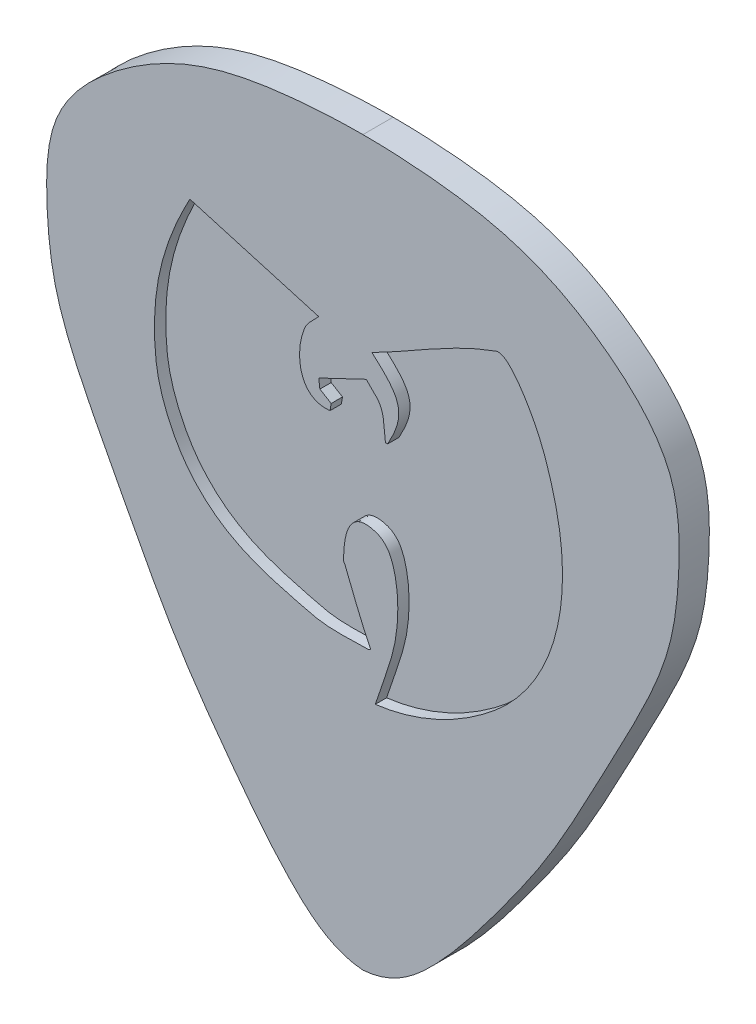
ISO-10303-21;
HEADER;
FILE_DESCRIPTION(('STEP AP214'),'2;1');
FILE_NAME('part.step','',(''),(''),'','','');
FILE_SCHEMA(('AUTOMOTIVE_DESIGN { 1 0 10303 214 1 1 1 1 }'));
ENDSEC;
DATA;
#1=APPLICATION_CONTEXT('core data for automotive mechanical design processes');
#2=APPLICATION_PROTOCOL_DEFINITION('international standard','automotive_design',2000,#1);
#3=PRODUCT_CONTEXT('',#1,'mechanical');
#4=PRODUCT('Part','Part','',(#3));
#5=PRODUCT_RELATED_PRODUCT_CATEGORY('part','',(#4));
#6=PRODUCT_DEFINITION_FORMATION('','',#4);
#7=PRODUCT_DEFINITION_CONTEXT('part definition',#1,'design');
#8=PRODUCT_DEFINITION('design','',#6,#7);
#9=PRODUCT_DEFINITION_SHAPE('','',#8);
#10=(LENGTH_UNIT() NAMED_UNIT(*) SI_UNIT(.MILLI.,.METRE.));
#11=(NAMED_UNIT(*) PLANE_ANGLE_UNIT() SI_UNIT($,.RADIAN.));
#12=(NAMED_UNIT(*) SI_UNIT($,.STERADIAN.) SOLID_ANGLE_UNIT());
#13=UNCERTAINTY_MEASURE_WITH_UNIT(LENGTH_MEASURE(1.E-05),#10,'distance_accuracy_value','');
#14=(GEOMETRIC_REPRESENTATION_CONTEXT(3) GLOBAL_UNCERTAINTY_ASSIGNED_CONTEXT((#13)) GLOBAL_UNIT_ASSIGNED_CONTEXT((#10,
#11,#12)) REPRESENTATION_CONTEXT('',''));
#15=CARTESIAN_POINT('',(0.,0.,0.));
#16=DIRECTION('',(0.,0.,1.));
#17=DIRECTION('',(1.,0.,0.));
#18=AXIS2_PLACEMENT_3D('',#15,#16,#17);
#19=CARTESIAN_POINT('',(0.,0.,1.33333333333333));
#20=CARTESIAN_POINT('',(-1.3725179585471,0.0920720774433055,1.33333333333333));
#21=CARTESIAN_POINT('',(-3.40311330723531,1.84725696244432,1.33333333333333));
#22=CARTESIAN_POINT('',(-5.83377601303966,4.99693592677089,1.33333333333333));
#23=CARTESIAN_POINT('',(-8.30396753302916,8.43054929060509,1.33333333333333));
#24=CARTESIAN_POINT('',(-10.213558633326,12.0661802752507,1.33333333333333));
#25=CARTESIAN_POINT('',(-12.1318717474483,15.6564896058509,1.33333333333333));
#26=CARTESIAN_POINT('',(-13.6853638227223,18.9210740220786,1.33333333333333));
#27=CARTESIAN_POINT('',(-14.0424116044245,22.4561533996481,1.33333333333333));
#28=CARTESIAN_POINT('',(-13.9658646966753,26.1770084955899,1.33333333333333));
#29=CARTESIAN_POINT('',(-10.9360646284182,29.231355796995,1.33333333333333));
#30=CARTESIAN_POINT('',(-7.15224424947317,31.2979340239972,1.33333333333333));
#31=CARTESIAN_POINT('',(-3.35647220863482,31.8876809648605,1.33333333333333));
#32=CARTESIAN_POINT('',(-0.93666484800668,32.004023721527,1.33333333333333));
#33=CARTESIAN_POINT('',(0.,32.0024926417289,1.33333333333333));
#34=B_SPLINE_CURVE_WITH_KNOTS('',3,(#19,#20,#21,#22,#23,#24,#25,#26,#27,#28,#29,#30,#31,#32,
#33),.UNSPECIFIED.,.F.,.F.,(4,1,1,1,1,1,1,1,1,1,1,1,4),(0.,0.0676881194936068,0.135065153333643,
0.209958152721667,0.288697785846604,0.349864900651225,0.424267439940274,0.47494369953207,
0.536327458499454,0.610656572670228,0.68545271983875,0.761085883741637,0.810203958906233),.UNSPECIFIED.);
#35=DIRECTION('',(0.,0.,-1.));
#36=VECTOR('',#35,1.);
#37=SURFACE_OF_LINEAR_EXTRUSION('',#34,#36);
#38=CARTESIAN_POINT('',(0.,0.,0.));
#39=CARTESIAN_POINT('',(-1.3725179585471,0.0920720774433055,0.));
#40=CARTESIAN_POINT('',(-3.40311330723531,1.84725696244432,0.));
#41=CARTESIAN_POINT('',(-5.83377601303966,4.99693592677089,0.));
#42=CARTESIAN_POINT('',(-8.30396753302916,8.43054929060509,0.));
#43=CARTESIAN_POINT('',(-10.213558633326,12.0661802752507,0.));
#44=CARTESIAN_POINT('',(-12.1318717474483,15.6564896058509,0.));
#45=CARTESIAN_POINT('',(-13.6853638227223,18.9210740220786,0.));
#46=CARTESIAN_POINT('',(-14.0424116044245,22.4561533996481,0.));
#47=CARTESIAN_POINT('',(-13.9658646966753,26.1770084955899,0.));
#48=CARTESIAN_POINT('',(-10.9360646284182,29.231355796995,0.));
#49=CARTESIAN_POINT('',(-7.15224424947317,31.2979340239972,0.));
#50=CARTESIAN_POINT('',(-3.35647220863482,31.8876809648605,0.));
#51=CARTESIAN_POINT('',(-0.93666484800668,32.004023721527,0.));
#52=CARTESIAN_POINT('',(0.,32.0024926417289,0.));
#53=B_SPLINE_CURVE_WITH_KNOTS('',3,(#38,#39,#40,#41,#42,#43,#44,#45,#46,#47,#48,#49,#50,#51,
#52),.UNSPECIFIED.,.F.,.F.,(4,1,1,1,1,1,1,1,1,1,1,1,4),(0.,0.0676881194936068,0.135065153333643,
0.209958152721667,0.288697785846604,0.349864900651225,0.424267439940274,0.47494369953207,
0.536327458499454,0.610656572670228,0.68545271983875,0.761085883741637,0.810203958906233),.UNSPECIFIED.);
#54=CARTESIAN_POINT('',(0.,0.,0.));
#55=VERTEX_POINT('',#54);
#56=CARTESIAN_POINT('',(0.,32.0024926417289,0.));
#57=VERTEX_POINT('',#56);
#58=EDGE_CURVE('E76',#55,#57,#53,.T.);
#59=ORIENTED_EDGE('',*,*,#58,.F.);
#60=DIRECTION('',(0.,0.,-1.));
#61=VECTOR('',#60,1.);
#62=CARTESIAN_POINT('',(0.,0.,1.33333333333333));
#63=LINE('',#62,#61);
#64=CARTESIAN_POINT('',(0.,0.,1.33333333333333));
#65=VERTEX_POINT('',#64);
#66=EDGE_CURVE('E12',#65,#55,#63,.T.);
#67=ORIENTED_EDGE('',*,*,#66,.F.);
#68=CARTESIAN_POINT('',(0.,32.0024926417289,1.33333333333333));
#69=VERTEX_POINT('',#68);
#70=EDGE_CURVE('E77',#65,#69,#34,.T.);
#71=ORIENTED_EDGE('',*,*,#70,.T.);
#72=DIRECTION('',(0.,0.,-1.));
#73=VECTOR('',#72,1.);
#74=CARTESIAN_POINT('',(0.,32.0024926417289,1.33333333333333));
#75=LINE('',#74,#73);
#76=EDGE_CURVE('E46',#69,#57,#75,.T.);
#77=ORIENTED_EDGE('',*,*,#76,.T.);
#78=EDGE_LOOP('',(#59,#67,#71,#77));
#79=FACE_BOUND('',#78,.T.);
#80=ADVANCED_FACE('F38',(#79),#37,.T.);
#81=CARTESIAN_POINT('',(0.,0.,1.33333333333333));
#82=CARTESIAN_POINT('',(1.3725179585471,0.0920720774433055,1.33333333333333));
#83=CARTESIAN_POINT('',(3.40311330723531,1.84725696244432,1.33333333333333));
#84=CARTESIAN_POINT('',(5.83377601303966,4.9969359267709,1.33333333333333));
#85=CARTESIAN_POINT('',(8.30396753302915,8.43054929060509,1.33333333333333));
#86=CARTESIAN_POINT('',(10.213558633326,12.0661802752507,1.33333333333333));
#87=CARTESIAN_POINT('',(12.1318717474483,15.6564896058509,1.33333333333333));
#88=CARTESIAN_POINT('',(13.6853638227223,18.9210740220786,1.33333333333333));
#89=CARTESIAN_POINT('',(14.0424116044245,22.4561533996481,1.33333333333333));
#90=CARTESIAN_POINT('',(13.9658646966753,26.1770084955899,1.33333333333333));
#91=CARTESIAN_POINT('',(10.9360646284182,29.231355796995,1.33333333333333));
#92=CARTESIAN_POINT('',(7.15224424947316,31.2979340239972,1.33333333333333));
#93=CARTESIAN_POINT('',(3.35647220863482,31.8876809648605,1.33333333333333));
#94=CARTESIAN_POINT('',(0.936664848006671,32.004023721527,1.33333333333333));
#95=CARTESIAN_POINT('',(0.,32.0024926417289,1.33333333333333));
#96=B_SPLINE_CURVE_WITH_KNOTS('',3,(#81,#82,#83,#84,#85,#86,#87,#88,#89,#90,#91,#92,#93,#94,
#95),.UNSPECIFIED.,.F.,.F.,(4,1,1,1,1,1,1,1,1,1,1,1,4),(0.,0.0676881194936068,0.135065153333643,
0.209958152721667,0.288697785846604,0.349864900651225,0.424267439940274,0.47494369953207,
0.536327458499454,0.610656572670228,0.68545271983875,0.761085883741637,0.810203958906233),.UNSPECIFIED.);
#97=DIRECTION('',(0.,0.,-1.));
#98=VECTOR('',#97,1.);
#99=SURFACE_OF_LINEAR_EXTRUSION('',#96,#98);
#100=CARTESIAN_POINT('',(0.,0.,0.));
#101=CARTESIAN_POINT('',(1.3725179585471,0.0920720774433055,0.));
#102=CARTESIAN_POINT('',(3.40311330723531,1.84725696244432,0.));
#103=CARTESIAN_POINT('',(5.83377601303966,4.9969359267709,0.));
#104=CARTESIAN_POINT('',(8.30396753302915,8.43054929060509,0.));
#105=CARTESIAN_POINT('',(10.213558633326,12.0661802752507,0.));
#106=CARTESIAN_POINT('',(12.1318717474483,15.6564896058509,0.));
#107=CARTESIAN_POINT('',(13.6853638227223,18.9210740220786,0.));
#108=CARTESIAN_POINT('',(14.0424116044245,22.4561533996481,0.));
#109=CARTESIAN_POINT('',(13.9658646966753,26.1770084955899,0.));
#110=CARTESIAN_POINT('',(10.9360646284182,29.231355796995,0.));
#111=CARTESIAN_POINT('',(7.15224424947316,31.2979340239972,0.));
#112=CARTESIAN_POINT('',(3.35647220863482,31.8876809648605,0.));
#113=CARTESIAN_POINT('',(0.936664848006671,32.004023721527,0.));
#114=CARTESIAN_POINT('',(0.,32.0024926417289,0.));
#115=B_SPLINE_CURVE_WITH_KNOTS('',3,(#100,#101,#102,#103,#104,#105,#106,#107,#108,#109,#110,
#111,#112,#113,#114),.UNSPECIFIED.,.F.,.F.,(4,1,1,1,1,1,1,1,1,1,1,1,4),(0.,0.0676881194936068,
0.135065153333643,0.209958152721667,0.288697785846604,0.349864900651225,0.424267439940274,
0.47494369953207,0.536327458499454,0.610656572670228,0.68545271983875,0.761085883741637,
0.810203958906233),.UNSPECIFIED.);
#116=EDGE_CURVE('E80',#55,#57,#115,.T.);
#117=ORIENTED_EDGE('',*,*,#116,.T.);
#118=ORIENTED_EDGE('',*,*,#76,.F.);
#119=EDGE_CURVE('E61',#65,#69,#96,.T.);
#120=ORIENTED_EDGE('',*,*,#119,.F.);
#121=ORIENTED_EDGE('',*,*,#66,.T.);
#122=EDGE_LOOP('',(#117,#118,#120,#121));
#123=FACE_BOUND('',#122,.T.);
#124=ADVANCED_FACE('F81',(#123),#99,.F.);
#125=CARTESIAN_POINT('',(0.,0.,1.33333333333333));
#126=DIRECTION('',(0.,0.,1.));
#127=DIRECTION('',(1.,0.,0.));
#128=AXIS2_PLACEMENT_3D('',#125,#126,#127);
#129=PLANE('',#128);
#130=DIRECTION('',(-1.,0.,0.));
#131=VECTOR('',#130,1.);
#132=CARTESIAN_POINT('',(0.,20.7029252702356,1.33333333333333));
#133=LINE('',#132,#131);
#134=CARTESIAN_POINT('',(1.09625773238705,20.7029252702356,1.33333333333333));
#135=VERTEX_POINT('',#134);
#136=CARTESIAN_POINT('',(0.996257732387049,20.7029252702356,1.33333333333333));
#137=VERTEX_POINT('',#136);
#138=EDGE_CURVE('E53',#135,#137,#133,.T.);
#139=ORIENTED_EDGE('',*,*,#138,.F.);
#140=CARTESIAN_POINT('',(1.09625773238705,20.7029252702356,1.33333333333333));
#141=CARTESIAN_POINT('',(1.93795000973069,22.2179713694542,1.33333333333333));
#142=CARTESIAN_POINT('',(1.68588743512747,22.7244992803378,1.33333333333333));
#143=CARTESIAN_POINT('',(0.396257732387049,23.8529252702356,1.33333333333333));
#144=B_SPLINE_CURVE_WITH_KNOTS('',3,(#140,#141,#142,#143),.UNSPECIFIED.,.F.,.F.,(4,4),(0.,1.),.UNSPECIFIED.);
#145=CARTESIAN_POINT('',(0.396257732387049,23.8529252702356,1.33333333333333));
#146=VERTEX_POINT('',#145);
#147=EDGE_CURVE('E353',#135,#146,#144,.T.);
#148=ORIENTED_EDGE('',*,*,#147,.T.);
#149=CARTESIAN_POINT('',(0.396257732387049,23.8529252702356,1.33333333333333));
#150=CARTESIAN_POINT('',(2.23175163182926,24.7820024292126,1.33333333333333));
#151=CARTESIAN_POINT('',(3.95533704972808,25.9709801655176,1.33333333333333));
#152=CARTESIAN_POINT('',(5.89625773238705,26.6529252702356,1.33333333333333));
#153=CARTESIAN_POINT('',(6.33911355974983,26.8085232636334,1.33333333333333));
#154=CARTESIAN_POINT('',(6.98795372594214,25.7921632235888,1.33333333333333));
#155=CARTESIAN_POINT('',(7.19625773238705,25.4529252702356,1.33333333333333));
#156=CARTESIAN_POINT('',(7.53559514309982,24.9002900585034,1.33333333333333));
#157=CARTESIAN_POINT('',(7.83042303780665,24.3144569048801,1.33333333333333));
#158=CARTESIAN_POINT('',(8.04625773238705,23.7029252702356,1.33333333333333));
#159=CARTESIAN_POINT('',(8.33282897470399,22.8909734170043,1.33333333333333));
#160=CARTESIAN_POINT('',(8.56408917374761,22.053760366477,1.33333333333333));
#161=CARTESIAN_POINT('',(8.69625773238705,21.2029252702356,1.33333333333333));
#162=CARTESIAN_POINT('',(9.19245815229133,18.0086350671018,1.33333333333333));
#163=CARTESIAN_POINT('',(8.29601793488238,14.8556724928422,1.33333333333333));
#164=CARTESIAN_POINT('',(5.69625773238705,12.7529252702356,1.33333333333333));
#165=CARTESIAN_POINT('',(4.2159256859603,11.5555978797434,1.33333333333333));
#166=CARTESIAN_POINT('',(2.43837693809927,10.6894401709497,1.33333333333333));
#167=CARTESIAN_POINT('',(0.546257732387048,10.4529252702356,1.33333333333333));
#168=B_SPLINE_CURVE_WITH_KNOTS('',3,(#149,#150,#151,#152,#153,#154,#155,#156,#157,#158,#159,
#160,#161,#162,#163,#164,#165,#166,#167),.UNSPECIFIED.,.F.,.F.,(4,3,3,3,3,3,4),(0.,
0.166666666666667,0.333333333333333,0.5,0.666666666666667,0.833333333333333,1.),.UNSPECIFIED.);
#169=CARTESIAN_POINT('',(0.546257732387048,10.4529252702356,1.33333333333333));
#170=VERTEX_POINT('',#169);
#171=EDGE_CURVE('E345',#146,#170,#168,.T.);
#172=ORIENTED_EDGE('',*,*,#171,.T.);
#173=CARTESIAN_POINT('',(0.546257732387048,10.4529252702356,1.33333333333333));
#174=CARTESIAN_POINT('',(0.829591065720381,11.3529252702356,1.33333333333333));
#175=CARTESIAN_POINT('',(1.19788020716251,12.2304697779415,1.33333333333333));
#176=CARTESIAN_POINT('',(1.39625773238705,13.1529252702356,1.33333333333333));
#177=CARTESIAN_POINT('',(1.59383504387885,14.0716597686725,1.33333333333333));
#178=CARTESIAN_POINT('',(1.65082613612268,15.5685346625568,1.33333333333333));
#179=CARTESIAN_POINT('',(1.19625773238705,16.5029252702356,1.33333333333333));
#180=CARTESIAN_POINT('',(1.07756729981885,16.7469000482925,1.33333333333333));
#181=CARTESIAN_POINT('',(0.852750351791945,16.9644795394064,1.33333333333333));
#182=CARTESIAN_POINT('',(0.596257732387048,17.0529252702356,1.33333333333333));
#183=CARTESIAN_POINT('',(-0.731476828633677,17.5107647740359,1.33333333333333));
#184=CARTESIAN_POINT('',(-0.853742267612952,16.0728148102248,1.33333333333333));
#185=CARTESIAN_POINT('',(-0.853742267612952,15.2529252702356,1.33333333333333));
#186=CARTESIAN_POINT('',(-0.853742267612952,15.2156574706106,1.33333333333333));
#187=CARTESIAN_POINT('',(-0.817583180921908,15.187527553508,1.33333333333333));
#188=CARTESIAN_POINT('',(-0.80374226761295,15.1529252702356,1.33333333333333));
#189=CARTESIAN_POINT('',(-0.440434770904239,14.2446565284639,1.33333333333333));
#190=CARTESIAN_POINT('',(-0.0912224258931754,13.3278855867961,1.33333333333333));
#191=CARTESIAN_POINT('',(0.346257732387048,12.4529252702356,1.33333333333333));
#192=B_SPLINE_CURVE_WITH_KNOTS('',3,(#173,#174,#175,#176,#177,#178,#179,#180,#181,#182,#183,
#184,#185,#186,#187,#188,#189,#190,#191),.UNSPECIFIED.,.F.,.F.,(4,3,3,3,3,3,4),(0.,
0.166666666666667,0.333333333333333,0.5,0.666666666666667,0.833333333333333,1.),.UNSPECIFIED.);
#193=CARTESIAN_POINT('',(0.346257732387048,12.4529252702356,1.33333333333333));
#194=VERTEX_POINT('',#193);
#195=EDGE_CURVE('E337',#170,#194,#192,.T.);
#196=ORIENTED_EDGE('',*,*,#195,.T.);
#197=CARTESIAN_POINT('',(0.346257732387048,12.4529252702356,1.33333333333333));
#198=CARTESIAN_POINT('',(0.312924399053714,12.436258603569,1.33333333333333));
#199=CARTESIAN_POINT('',(0.283525532012044,12.4029252702356,1.33333333333333));
#200=CARTESIAN_POINT('',(0.246257732387048,12.4029252702356,1.33333333333333));
#201=CARTESIAN_POINT('',(-0.587742001159405,12.4029252702356,1.33333333333333));
#202=CARTESIAN_POINT('',(-1.44349456393286,12.3053038790942,1.33333333333333));
#203=CARTESIAN_POINT('',(-2.25374226761295,12.5029252702356,1.33333333333333));
#204=CARTESIAN_POINT('',(-4.34301313481825,13.0125035305296,1.33333333333333));
#205=CARTESIAN_POINT('',(-6.18783184243439,13.4645145515178,1.33333333333333));
#206=CARTESIAN_POINT('',(-7.65374226761295,15.2529252702356,1.33333333333333));
#207=CARTESIAN_POINT('',(-8.41675097215853,16.1837958897812,1.33333333333333));
#208=CARTESIAN_POINT('',(-9.02717765961536,17.6005614942585,1.33333333333333));
#209=CARTESIAN_POINT('',(-9.15374226761295,18.8029252702356,1.33333333333333));
#210=CARTESIAN_POINT('',(-9.42677074610345,21.3966958158954,1.33333333333333));
#211=CARTESIAN_POINT('',(-8.85540681074634,23.4598181230533,1.33333333333333));
#212=CARTESIAN_POINT('',(-7.65374226761295,25.7029252702356,1.33333333333333));
#213=B_SPLINE_CURVE_WITH_KNOTS('',3,(#197,#198,#199,#200,#201,#202,#203,#204,#205,#206,#207,
#208,#209,#210,#211,#212),.UNSPECIFIED.,.F.,.F.,(4,3,3,3,3,4),(0.,0.2,0.4,0.6,0.8,1.),.UNSPECIFIED.);
#214=CARTESIAN_POINT('',(-7.65374226761295,25.7029252702356,1.33333333333333));
#215=VERTEX_POINT('',#214);
#216=EDGE_CURVE('E332',#194,#215,#213,.T.);
#217=ORIENTED_EDGE('',*,*,#216,.T.);
#218=DIRECTION('',(-0.960564264414562,0.278058076541057,0.));
#219=VECTOR('',#218,1.);
#220=CARTESIAN_POINT('',(6.27330348151906,21.6714120270659,1.33333333333333));
#221=LINE('',#220,#219);
#222=CARTESIAN_POINT('',(-1.95374226761295,24.0529252702356,1.33333333333333));
#223=VERTEX_POINT('',#222);
#224=EDGE_CURVE('E326',#223,#215,#221,.T.);
#225=ORIENTED_EDGE('',*,*,#224,.F.);
#226=CARTESIAN_POINT('',(-1.95374226761293,24.0529252702357,1.33333333333333));
#227=CARTESIAN_POINT('',(-2.15374226761293,23.8195919369024,1.33333333333333));
#228=CARTESIAN_POINT('',(-2.42543688786163,23.6321781555768,1.33333333333333));
#229=CARTESIAN_POINT('',(-2.55374226761294,23.3529252702357,1.33333333333333));
#230=CARTESIAN_POINT('',(-3.01907702323682,22.3401378609367,1.33333333333333));
#231=CARTESIAN_POINT('',(-2.92458904012457,20.5394978510678,1.33333333333333));
#232=CARTESIAN_POINT('',(-1.45374226761296,20.7029252702357,1.33333333333333));
#233=B_SPLINE_CURVE_WITH_KNOTS('',3,(#226,#227,#228,#229,#230,#231,#232),.UNSPECIFIED.,.F.,.F.,
(4,3,4),(0.,0.5,1.),.UNSPECIFIED.);
#234=CARTESIAN_POINT('',(-1.45374226761296,20.7029252702357,1.33333333333333));
#235=VERTEX_POINT('',#234);
#236=EDGE_CURVE('E321',#223,#235,#233,.T.);
#237=ORIENTED_EDGE('',*,*,#236,.T.);
#238=DIRECTION('',(-0.164398987305359,-0.986393923832143,0.));
#239=VECTOR('',#238,1.);
#240=CARTESIAN_POINT('',(-4.77168306095896,0.795280510159835,1.33333333333333));
#241=LINE('',#240,#239);
#242=CARTESIAN_POINT('',(-1.40374226761295,21.0029252702356,1.33333333333333));
#243=VERTEX_POINT('',#242);
#244=EDGE_CURVE('E318',#243,#235,#241,.T.);
#245=ORIENTED_EDGE('',*,*,#244,.F.);
#246=DIRECTION('',(0.857492925712543,-0.514495755427528,0.));
#247=VECTOR('',#246,1.);
#248=CARTESIAN_POINT('',(8.89441760720643,14.824029345344,1.33333333333333));
#249=LINE('',#248,#247);
#250=CARTESIAN_POINT('',(-1.90374226761296,21.3029252702356,1.33333333333333));
#251=VERTEX_POINT('',#250);
#252=EDGE_CURVE('E315',#251,#243,#249,.T.);
#253=ORIENTED_EDGE('',*,*,#252,.F.);
#254=DIRECTION('',(0.124034734589207,-0.992277876713668,0.));
#255=VECTOR('',#254,1.);
#256=CARTESIAN_POINT('',(0.747444569763918,0.0934305712204889,1.33333333333333));
#257=LINE('',#256,#255);
#258=CARTESIAN_POINT('',(-1.95374226761295,21.7029252702357,1.33333333333333));
#259=VERTEX_POINT('',#258);
#260=EDGE_CURVE('E313',#259,#251,#257,.T.);
#261=ORIENTED_EDGE('',*,*,#260,.F.);
#262=DIRECTION('',(-0.902860518823931,-0.429933580392347,0.));
#263=VECTOR('',#262,1.);
#264=CARTESIAN_POINT('',(-8.78556106009385,18.4496782261971,1.33333333333333));
#265=LINE('',#264,#263);
#266=CARTESIAN_POINT('',(0.146257732387051,22.7029252702356,1.33333333333333));
#267=VERTEX_POINT('',#266);
#268=EDGE_CURVE('E307',#267,#259,#265,.T.);
#269=ORIENTED_EDGE('',*,*,#268,.F.);
#270=CARTESIAN_POINT('',(0.146257732387049,22.7029252702356,1.33333333333333));
#271=CARTESIAN_POINT('',(0.362924399053714,22.4529252702356,1.33333333333333));
#272=CARTESIAN_POINT('',(0.666859065245776,22.2573927223327,1.33333333333333));
#273=CARTESIAN_POINT('',(0.796257732387048,21.9529252702356,1.33333333333333));
#274=CARTESIAN_POINT('',(0.961305899884476,21.5645766408299,1.33333333333333));
#275=CARTESIAN_POINT('',(0.929591065720382,21.1195919369023,1.33333333333333));
#276=CARTESIAN_POINT('',(0.996257732387049,20.7029252702356,1.33333333333333));
#277=B_SPLINE_CURVE_WITH_KNOTS('',3,(#270,#271,#272,#273,#274,#275,#276),.UNSPECIFIED.,.F.,.F.,
(4,3,4),(0.,0.5,1.),.UNSPECIFIED.);
#278=EDGE_CURVE('E302',#267,#137,#277,.T.);
#279=ORIENTED_EDGE('',*,*,#278,.T.);
#280=EDGE_LOOP('',(#139,#148,#172,#196,#217,#225,#237,#245,#253,#261,#269,#279));
#281=FACE_BOUND('',#280,.T.);
#282=ORIENTED_EDGE('',*,*,#70,.F.);
#283=ORIENTED_EDGE('',*,*,#119,.T.);
#284=EDGE_LOOP('',(#282,#283));
#285=FACE_BOUND('',#284,.T.);
#286=ADVANCED_FACE('F112',(#281,#285),#129,.T.);
#287=CARTESIAN_POINT('',(0.,0.,0.));
#288=DIRECTION('',(0.,0.,1.));
#289=DIRECTION('',(1.,0.,0.));
#290=AXIS2_PLACEMENT_3D('',#287,#288,#289);
#291=PLANE('',#290);
#292=ORIENTED_EDGE('',*,*,#58,.T.);
#293=ORIENTED_EDGE('',*,*,#116,.F.);
#294=EDGE_LOOP('',(#292,#293));
#295=FACE_BOUND('',#294,.T.);
#296=ADVANCED_FACE('F84',(#295),#291,.F.);
#297=CARTESIAN_POINT('',(0.,20.7029252702356,0.833333333333333));
#298=DIRECTION('',(0.,1.,0.));
#299=DIRECTION('',(0.,0.,1.));
#300=AXIS2_PLACEMENT_3D('',#297,#298,#299);
#301=PLANE('',#300);
#302=ORIENTED_EDGE('',*,*,#138,.T.);
#303=DIRECTION('',(0.,0.,1.));
#304=VECTOR('',#303,1.);
#305=CARTESIAN_POINT('',(0.996257732387049,20.7029252702356,0.833333333333333));
#306=LINE('',#305,#304);
#307=CARTESIAN_POINT('',(0.996257732387049,20.7029252702356,0.833333333333333));
#308=VERTEX_POINT('',#307);
#309=EDGE_CURVE('E292',#308,#137,#306,.T.);
#310=ORIENTED_EDGE('',*,*,#309,.F.);
#311=DIRECTION('',(-1.,0.,0.));
#312=VECTOR('',#311,1.);
#313=CARTESIAN_POINT('',(0.,20.7029252702356,0.833333333333333));
#314=LINE('',#313,#312);
#315=CARTESIAN_POINT('',(1.09625773238705,20.7029252702356,0.833333333333333));
#316=VERTEX_POINT('',#315);
#317=EDGE_CURVE('E138',#316,#308,#314,.T.);
#318=ORIENTED_EDGE('',*,*,#317,.F.);
#319=DIRECTION('',(0.,0.,1.));
#320=VECTOR('',#319,1.);
#321=CARTESIAN_POINT('',(1.09625773238705,20.7029252702356,0.833333333333333));
#322=LINE('',#321,#320);
#323=EDGE_CURVE('E85',#316,#135,#322,.T.);
#324=ORIENTED_EDGE('',*,*,#323,.T.);
#325=EDGE_LOOP('',(#302,#310,#318,#324));
#326=FACE_BOUND('',#325,.T.);
#327=ADVANCED_FACE('F115',(#326),#301,.F.);
#328=CARTESIAN_POINT('',(1.09625773238705,20.7029252702356,0.833333333333333));
#329=CARTESIAN_POINT('',(1.93795000973069,22.2179713694542,0.833333333333333));
#330=CARTESIAN_POINT('',(1.68588743512747,22.7244992803378,0.833333333333333));
#331=CARTESIAN_POINT('',(0.396257732387049,23.8529252702356,0.833333333333333));
#332=B_SPLINE_CURVE_WITH_KNOTS('',3,(#328,#329,#330,#331),.UNSPECIFIED.,.F.,.F.,(4,4),(0.,1.),.UNSPECIFIED.);
#333=DIRECTION('',(0.,0.,1.));
#334=VECTOR('',#333,1.);
#335=SURFACE_OF_LINEAR_EXTRUSION('',#332,#334);
#336=ORIENTED_EDGE('',*,*,#147,.F.);
#337=ORIENTED_EDGE('',*,*,#323,.F.);
#338=CARTESIAN_POINT('',(0.396257732387049,23.8529252702356,0.833333333333333));
#339=VERTEX_POINT('',#338);
#340=EDGE_CURVE('E286',#316,#339,#332,.T.);
#341=ORIENTED_EDGE('',*,*,#340,.T.);
#342=DIRECTION('',(0.,0.,1.));
#343=VECTOR('',#342,1.);
#344=CARTESIAN_POINT('',(0.396257732387049,23.8529252702356,0.833333333333333));
#345=LINE('',#344,#343);
#346=EDGE_CURVE('E87',#339,#146,#345,.T.);
#347=ORIENTED_EDGE('',*,*,#346,.T.);
#348=EDGE_LOOP('',(#336,#337,#341,#347));
#349=FACE_BOUND('',#348,.T.);
#350=ADVANCED_FACE('F121',(#349),#335,.T.);
#351=CARTESIAN_POINT('',(0.396257732387049,23.8529252702356,0.833333333333333));
#352=CARTESIAN_POINT('',(2.23175163182926,24.7820024292126,0.833333333333333));
#353=CARTESIAN_POINT('',(3.95533704972808,25.9709801655176,0.833333333333333));
#354=CARTESIAN_POINT('',(5.89625773238705,26.6529252702356,0.833333333333333));
#355=CARTESIAN_POINT('',(6.33911355974983,26.8085232636334,0.833333333333333));
#356=CARTESIAN_POINT('',(6.98795372594214,25.7921632235888,0.833333333333333));
#357=CARTESIAN_POINT('',(7.19625773238705,25.4529252702356,0.833333333333333));
#358=CARTESIAN_POINT('',(7.53559514309982,24.9002900585034,0.833333333333333));
#359=CARTESIAN_POINT('',(7.83042303780665,24.3144569048801,0.833333333333333));
#360=CARTESIAN_POINT('',(8.04625773238705,23.7029252702356,0.833333333333333));
#361=CARTESIAN_POINT('',(8.33282897470399,22.8909734170043,0.833333333333333));
#362=CARTESIAN_POINT('',(8.56408917374761,22.053760366477,0.833333333333333));
#363=CARTESIAN_POINT('',(8.69625773238705,21.2029252702356,0.833333333333333));
#364=CARTESIAN_POINT('',(9.19245815229133,18.0086350671018,0.833333333333333));
#365=CARTESIAN_POINT('',(8.29601793488238,14.8556724928422,0.833333333333333));
#366=CARTESIAN_POINT('',(5.69625773238705,12.7529252702356,0.833333333333333));
#367=CARTESIAN_POINT('',(4.2159256859603,11.5555978797434,0.833333333333333));
#368=CARTESIAN_POINT('',(2.43837693809927,10.6894401709497,0.833333333333333));
#369=CARTESIAN_POINT('',(0.546257732387048,10.4529252702356,0.833333333333333));
#370=B_SPLINE_CURVE_WITH_KNOTS('',3,(#351,#352,#353,#354,#355,#356,#357,#358,#359,#360,#361,
#362,#363,#364,#365,#366,#367,#368,#369),.UNSPECIFIED.,.F.,.F.,(4,3,3,3,3,3,4),(0.,
0.166666666666667,0.333333333333333,0.5,0.666666666666667,0.833333333333333,1.),.UNSPECIFIED.);
#371=DIRECTION('',(0.,0.,1.));
#372=VECTOR('',#371,1.);
#373=SURFACE_OF_LINEAR_EXTRUSION('',#370,#372);
#374=ORIENTED_EDGE('',*,*,#171,.F.);
#375=ORIENTED_EDGE('',*,*,#346,.F.);
#376=CARTESIAN_POINT('',(0.546257732387048,10.4529252702356,0.833333333333333));
#377=VERTEX_POINT('',#376);
#378=EDGE_CURVE('E293',#339,#377,#370,.T.);
#379=ORIENTED_EDGE('',*,*,#378,.T.);
#380=DIRECTION('',(0.,0.,1.));
#381=VECTOR('',#380,1.);
#382=CARTESIAN_POINT('',(0.546257732387048,10.4529252702356,0.833333333333333));
#383=LINE('',#382,#381);
#384=EDGE_CURVE('E366',#377,#170,#383,.T.);
#385=ORIENTED_EDGE('',*,*,#384,.T.);
#386=EDGE_LOOP('',(#374,#375,#379,#385));
#387=FACE_BOUND('',#386,.T.);
#388=ADVANCED_FACE('F212',(#387),#373,.T.);
#389=CARTESIAN_POINT('',(0.546257732387048,10.4529252702356,0.833333333333333));
#390=CARTESIAN_POINT('',(0.829591065720381,11.3529252702356,0.833333333333333));
#391=CARTESIAN_POINT('',(1.19788020716251,12.2304697779415,0.833333333333333));
#392=CARTESIAN_POINT('',(1.39625773238705,13.1529252702356,0.833333333333333));
#393=CARTESIAN_POINT('',(1.59383504387885,14.0716597686725,0.833333333333333));
#394=CARTESIAN_POINT('',(1.65082613612268,15.5685346625568,0.833333333333333));
#395=CARTESIAN_POINT('',(1.19625773238705,16.5029252702356,0.833333333333333));
#396=CARTESIAN_POINT('',(1.07756729981885,16.7469000482925,0.833333333333333));
#397=CARTESIAN_POINT('',(0.852750351791945,16.9644795394064,0.833333333333333));
#398=CARTESIAN_POINT('',(0.596257732387048,17.0529252702356,0.833333333333333));
#399=CARTESIAN_POINT('',(-0.731476828633677,17.5107647740359,0.833333333333333));
#400=CARTESIAN_POINT('',(-0.853742267612952,16.0728148102248,0.833333333333333));
#401=CARTESIAN_POINT('',(-0.853742267612952,15.2529252702356,0.833333333333333));
#402=CARTESIAN_POINT('',(-0.853742267612952,15.2156574706106,0.833333333333333));
#403=CARTESIAN_POINT('',(-0.817583180921908,15.187527553508,0.833333333333333));
#404=CARTESIAN_POINT('',(-0.80374226761295,15.1529252702356,0.833333333333333));
#405=CARTESIAN_POINT('',(-0.440434770904239,14.2446565284639,0.833333333333333));
#406=CARTESIAN_POINT('',(-0.0912224258931754,13.3278855867961,0.833333333333333));
#407=CARTESIAN_POINT('',(0.346257732387048,12.4529252702356,0.833333333333333));
#408=B_SPLINE_CURVE_WITH_KNOTS('',3,(#389,#390,#391,#392,#393,#394,#395,#396,#397,#398,#399,
#400,#401,#402,#403,#404,#405,#406,#407),.UNSPECIFIED.,.F.,.F.,(4,3,3,3,3,3,4),(0.,
0.166666666666667,0.333333333333333,0.5,0.666666666666667,0.833333333333333,1.),.UNSPECIFIED.);
#409=DIRECTION('',(0.,0.,1.));
#410=VECTOR('',#409,1.);
#411=SURFACE_OF_LINEAR_EXTRUSION('',#408,#410);
#412=ORIENTED_EDGE('',*,*,#195,.F.);
#413=ORIENTED_EDGE('',*,*,#384,.F.);
#414=CARTESIAN_POINT('',(0.346257732387048,12.4529252702356,0.833333333333333));
#415=VERTEX_POINT('',#414);
#416=EDGE_CURVE('E459',#377,#415,#408,.T.);
#417=ORIENTED_EDGE('',*,*,#416,.T.);
#418=DIRECTION('',(0.,0.,1.));
#419=VECTOR('',#418,1.);
#420=CARTESIAN_POINT('',(0.346257732387048,12.4529252702356,0.833333333333333));
#421=LINE('',#420,#419);
#422=EDGE_CURVE('E369',#415,#194,#421,.T.);
#423=ORIENTED_EDGE('',*,*,#422,.T.);
#424=EDGE_LOOP('',(#412,#413,#417,#423));
#425=FACE_BOUND('',#424,.T.);
#426=ADVANCED_FACE('F220',(#425),#411,.T.);
#427=CARTESIAN_POINT('',(0.346257732387048,12.4529252702356,0.833333333333333));
#428=CARTESIAN_POINT('',(0.312924399053714,12.436258603569,0.833333333333333));
#429=CARTESIAN_POINT('',(0.283525532012044,12.4029252702356,0.833333333333333));
#430=CARTESIAN_POINT('',(0.246257732387048,12.4029252702356,0.833333333333333));
#431=CARTESIAN_POINT('',(-0.587742001159405,12.4029252702356,0.833333333333333));
#432=CARTESIAN_POINT('',(-1.44349456393286,12.3053038790942,0.833333333333333));
#433=CARTESIAN_POINT('',(-2.25374226761295,12.5029252702356,0.833333333333333));
#434=CARTESIAN_POINT('',(-4.34301313481825,13.0125035305296,0.833333333333333));
#435=CARTESIAN_POINT('',(-6.18783184243439,13.4645145515178,0.833333333333333));
#436=CARTESIAN_POINT('',(-7.65374226761295,15.2529252702356,0.833333333333333));
#437=CARTESIAN_POINT('',(-8.41675097215853,16.1837958897812,0.833333333333333));
#438=CARTESIAN_POINT('',(-9.02717765961536,17.6005614942585,0.833333333333333));
#439=CARTESIAN_POINT('',(-9.15374226761295,18.8029252702356,0.833333333333333));
#440=CARTESIAN_POINT('',(-9.42677074610345,21.3966958158954,0.833333333333333));
#441=CARTESIAN_POINT('',(-8.85540681074634,23.4598181230533,0.833333333333333));
#442=CARTESIAN_POINT('',(-7.65374226761295,25.7029252702356,0.833333333333333));
#443=B_SPLINE_CURVE_WITH_KNOTS('',3,(#427,#428,#429,#430,#431,#432,#433,#434,#435,#436,#437,
#438,#439,#440,#441,#442),.UNSPECIFIED.,.F.,.F.,(4,3,3,3,3,4),(0.,0.2,0.4,0.6,0.8,1.),.UNSPECIFIED.);
#444=DIRECTION('',(0.,0.,1.));
#445=VECTOR('',#444,1.);
#446=SURFACE_OF_LINEAR_EXTRUSION('',#443,#445);
#447=ORIENTED_EDGE('',*,*,#216,.F.);
#448=ORIENTED_EDGE('',*,*,#422,.F.);
#449=CARTESIAN_POINT('',(-7.65374226761295,25.7029252702356,0.833333333333333));
#450=VERTEX_POINT('',#449);
#451=EDGE_CURVE('E461',#415,#450,#443,.T.);
#452=ORIENTED_EDGE('',*,*,#451,.T.);
#453=DIRECTION('',(0.,0.,1.));
#454=VECTOR('',#453,1.);
#455=CARTESIAN_POINT('',(-7.65374226761295,25.7029252702356,0.833333333333333));
#456=LINE('',#455,#454);
#457=EDGE_CURVE('E372',#450,#215,#456,.T.);
#458=ORIENTED_EDGE('',*,*,#457,.T.);
#459=EDGE_LOOP('',(#447,#448,#452,#458));
#460=FACE_BOUND('',#459,.T.);
#461=ADVANCED_FACE('F228',(#460),#446,.T.);
#462=CARTESIAN_POINT('',(6.27330348151906,21.6714120270659,0.833333333333333));
#463=DIRECTION('',(0.278058076541057,0.960564264414562,0.));
#464=DIRECTION('',(-0.960564264414562,0.278058076541057,0.));
#465=AXIS2_PLACEMENT_3D('',#462,#463,#464);
#466=PLANE('',#465);
#467=ORIENTED_EDGE('',*,*,#224,.T.);
#468=ORIENTED_EDGE('',*,*,#457,.F.);
#469=DIRECTION('',(-0.960564264414562,0.278058076541057,0.));
#470=VECTOR('',#469,1.);
#471=CARTESIAN_POINT('',(6.27330348151906,21.6714120270659,0.833333333333333));
#472=LINE('',#471,#470);
#473=CARTESIAN_POINT('',(-1.95374226761295,24.0529252702356,0.833333333333333));
#474=VERTEX_POINT('',#473);
#475=EDGE_CURVE('E159',#474,#450,#472,.T.);
#476=ORIENTED_EDGE('',*,*,#475,.F.);
#477=DIRECTION('',(0.,0.,1.));
#478=VECTOR('',#477,1.);
#479=CARTESIAN_POINT('',(-1.95374226761295,24.0529252702356,0.833333333333333));
#480=LINE('',#479,#478);
#481=EDGE_CURVE('E375',#474,#223,#480,.T.);
#482=ORIENTED_EDGE('',*,*,#481,.T.);
#483=EDGE_LOOP('',(#467,#468,#476,#482));
#484=FACE_BOUND('',#483,.T.);
#485=ADVANCED_FACE('F170',(#484),#466,.F.);
#486=CARTESIAN_POINT('',(-1.95374226761293,24.0529252702357,0.833333333333333));
#487=CARTESIAN_POINT('',(-2.15374226761293,23.8195919369024,0.833333333333333));
#488=CARTESIAN_POINT('',(-2.42543688786163,23.6321781555768,0.833333333333333));
#489=CARTESIAN_POINT('',(-2.55374226761294,23.3529252702357,0.833333333333333));
#490=CARTESIAN_POINT('',(-3.01907702323682,22.3401378609367,0.833333333333333));
#491=CARTESIAN_POINT('',(-2.92458904012457,20.5394978510678,0.833333333333333));
#492=CARTESIAN_POINT('',(-1.45374226761296,20.7029252702357,0.833333333333333));
#493=B_SPLINE_CURVE_WITH_KNOTS('',3,(#486,#487,#488,#489,#490,#491,#492),.UNSPECIFIED.,.F.,.F.,
(4,3,4),(0.,0.5,1.),.UNSPECIFIED.);
#494=DIRECTION('',(0.,0.,1.));
#495=VECTOR('',#494,1.);
#496=SURFACE_OF_LINEAR_EXTRUSION('',#493,#495);
#497=ORIENTED_EDGE('',*,*,#236,.F.);
#498=ORIENTED_EDGE('',*,*,#481,.F.);
#499=CARTESIAN_POINT('',(-1.45374226761296,20.7029252702357,0.833333333333333));
#500=VERTEX_POINT('',#499);
#501=EDGE_CURVE('E153',#474,#500,#493,.T.);
#502=ORIENTED_EDGE('',*,*,#501,.T.);
#503=DIRECTION('',(0.,0.,1.));
#504=VECTOR('',#503,1.);
#505=CARTESIAN_POINT('',(-1.45374226761296,20.7029252702357,0.833333333333333));
#506=LINE('',#505,#504);
#507=EDGE_CURVE('E378',#500,#235,#506,.T.);
#508=ORIENTED_EDGE('',*,*,#507,.T.);
#509=EDGE_LOOP('',(#497,#498,#502,#508));
#510=FACE_BOUND('',#509,.T.);
#511=ADVANCED_FACE('F165',(#510),#496,.T.);
#512=CARTESIAN_POINT('',(-4.77168306095896,0.795280510159835,0.833333333333333));
#513=DIRECTION('',(-0.986393923832144,0.164398987305359,0.));
#514=DIRECTION('',(-0.164398987305359,-0.986393923832144,0.));
#515=AXIS2_PLACEMENT_3D('',#512,#513,#514);
#516=PLANE('',#515);
#517=ORIENTED_EDGE('',*,*,#244,.T.);
#518=ORIENTED_EDGE('',*,*,#507,.F.);
#519=DIRECTION('',(-0.164398987305359,-0.986393923832143,0.));
#520=VECTOR('',#519,1.);
#521=CARTESIAN_POINT('',(-4.77168306095896,0.795280510159835,0.833333333333333));
#522=LINE('',#521,#520);
#523=CARTESIAN_POINT('',(-1.40374226761295,21.0029252702356,0.833333333333333));
#524=VERTEX_POINT('',#523);
#525=EDGE_CURVE('E150',#524,#500,#522,.T.);
#526=ORIENTED_EDGE('',*,*,#525,.F.);
#527=DIRECTION('',(0.,0.,1.));
#528=VECTOR('',#527,1.);
#529=CARTESIAN_POINT('',(-1.40374226761295,21.0029252702356,0.833333333333333));
#530=LINE('',#529,#528);
#531=EDGE_CURVE('E381',#524,#243,#530,.T.);
#532=ORIENTED_EDGE('',*,*,#531,.T.);
#533=EDGE_LOOP('',(#517,#518,#526,#532));
#534=FACE_BOUND('',#533,.T.);
#535=ADVANCED_FACE('F169',(#534),#516,.F.);
#536=CARTESIAN_POINT('',(8.89441760720643,14.824029345344,0.833333333333333));
#537=DIRECTION('',(-0.514495755427528,-0.857492925712543,0.));
#538=DIRECTION('',(0.857492925712543,-0.514495755427528,0.));
#539=AXIS2_PLACEMENT_3D('',#536,#537,#538);
#540=PLANE('',#539);
#541=ORIENTED_EDGE('',*,*,#252,.T.);
#542=ORIENTED_EDGE('',*,*,#531,.F.);
#543=DIRECTION('',(0.857492925712543,-0.514495755427528,0.));
#544=VECTOR('',#543,1.);
#545=CARTESIAN_POINT('',(8.89441760720643,14.824029345344,0.833333333333333));
#546=LINE('',#545,#544);
#547=CARTESIAN_POINT('',(-1.90374226761296,21.3029252702356,0.833333333333333));
#548=VERTEX_POINT('',#547);
#549=EDGE_CURVE('E147',#548,#524,#546,.T.);
#550=ORIENTED_EDGE('',*,*,#549,.F.);
#551=DIRECTION('',(0.,0.,1.));
#552=VECTOR('',#551,1.);
#553=CARTESIAN_POINT('',(-1.90374226761296,21.3029252702356,0.833333333333333));
#554=LINE('',#553,#552);
#555=EDGE_CURVE('E384',#548,#251,#554,.T.);
#556=ORIENTED_EDGE('',*,*,#555,.T.);
#557=EDGE_LOOP('',(#541,#542,#550,#556));
#558=FACE_BOUND('',#557,.T.);
#559=ADVANCED_FACE('F175',(#558),#540,.F.);
#560=CARTESIAN_POINT('',(0.747444569763918,0.0934305712204889,0.833333333333333));
#561=DIRECTION('',(-0.992277876713668,-0.124034734589207,0.));
#562=DIRECTION('',(0.124034734589207,-0.992277876713668,0.));
#563=AXIS2_PLACEMENT_3D('',#560,#561,#562);
#564=PLANE('',#563);
#565=ORIENTED_EDGE('',*,*,#260,.T.);
#566=ORIENTED_EDGE('',*,*,#555,.F.);
#567=DIRECTION('',(0.124034734589207,-0.992277876713668,0.));
#568=VECTOR('',#567,1.);
#569=CARTESIAN_POINT('',(0.747444569763918,0.0934305712204889,0.833333333333333));
#570=LINE('',#569,#568);
#571=CARTESIAN_POINT('',(-1.95374226761295,21.7029252702357,0.833333333333333));
#572=VERTEX_POINT('',#571);
#573=EDGE_CURVE('E144',#572,#548,#570,.T.);
#574=ORIENTED_EDGE('',*,*,#573,.F.);
#575=DIRECTION('',(0.,0.,1.));
#576=VECTOR('',#575,1.);
#577=CARTESIAN_POINT('',(-1.95374226761295,21.7029252702357,0.833333333333333));
#578=LINE('',#577,#576);
#579=EDGE_CURVE('E387',#572,#259,#578,.T.);
#580=ORIENTED_EDGE('',*,*,#579,.T.);
#581=EDGE_LOOP('',(#565,#566,#574,#580));
#582=FACE_BOUND('',#581,.T.);
#583=ADVANCED_FACE('F178',(#582),#564,.F.);
#584=CARTESIAN_POINT('',(-8.78556106009385,18.4496782261971,0.833333333333333));
#585=DIRECTION('',(-0.429933580392347,0.902860518823931,0.));
#586=DIRECTION('',(-0.902860518823931,-0.429933580392347,0.));
#587=AXIS2_PLACEMENT_3D('',#584,#585,#586);
#588=PLANE('',#587);
#589=ORIENTED_EDGE('',*,*,#268,.T.);
#590=ORIENTED_EDGE('',*,*,#579,.F.);
#591=DIRECTION('',(-0.902860518823931,-0.429933580392347,0.));
#592=VECTOR('',#591,1.);
#593=CARTESIAN_POINT('',(-8.78556106009385,18.4496782261971,0.833333333333333));
#594=LINE('',#593,#592);
#595=CARTESIAN_POINT('',(0.146257732387051,22.7029252702356,0.833333333333333));
#596=VERTEX_POINT('',#595);
#597=EDGE_CURVE('E137',#596,#572,#594,.T.);
#598=ORIENTED_EDGE('',*,*,#597,.F.);
#599=DIRECTION('',(0.,0.,1.));
#600=VECTOR('',#599,1.);
#601=CARTESIAN_POINT('',(0.146257732387051,22.7029252702356,0.833333333333333));
#602=LINE('',#601,#600);
#603=EDGE_CURVE('E390',#596,#267,#602,.T.);
#604=ORIENTED_EDGE('',*,*,#603,.T.);
#605=EDGE_LOOP('',(#589,#590,#598,#604));
#606=FACE_BOUND('',#605,.T.);
#607=ADVANCED_FACE('F127',(#606),#588,.F.);
#608=CARTESIAN_POINT('',(0.146257732387049,22.7029252702356,0.833333333333333));
#609=CARTESIAN_POINT('',(0.362924399053714,22.4529252702356,0.833333333333333));
#610=CARTESIAN_POINT('',(0.666859065245776,22.2573927223327,0.833333333333333));
#611=CARTESIAN_POINT('',(0.796257732387048,21.9529252702356,0.833333333333333));
#612=CARTESIAN_POINT('',(0.961305899884476,21.5645766408299,0.833333333333333));
#613=CARTESIAN_POINT('',(0.929591065720382,21.1195919369023,0.833333333333333));
#614=CARTESIAN_POINT('',(0.996257732387049,20.7029252702356,0.833333333333333));
#615=B_SPLINE_CURVE_WITH_KNOTS('',3,(#608,#609,#610,#611,#612,#613,#614),.UNSPECIFIED.,.F.,.F.,
(4,3,4),(0.,0.5,1.),.UNSPECIFIED.);
#616=DIRECTION('',(0.,0.,1.));
#617=VECTOR('',#616,1.);
#618=SURFACE_OF_LINEAR_EXTRUSION('',#615,#617);
#619=ORIENTED_EDGE('',*,*,#278,.F.);
#620=ORIENTED_EDGE('',*,*,#603,.F.);
#621=EDGE_CURVE('E130',#596,#308,#615,.T.);
#622=ORIENTED_EDGE('',*,*,#621,.T.);
#623=ORIENTED_EDGE('',*,*,#309,.T.);
#624=EDGE_LOOP('',(#619,#620,#622,#623));
#625=FACE_BOUND('',#624,.T.);
#626=ADVANCED_FACE('F122',(#625),#618,.T.);
#627=CARTESIAN_POINT('',(0.796257732387048,21.9529252702356,0.833333333333333));
#628=DIRECTION('',(0.,0.,-1.));
#629=DIRECTION('',(-1.,0.,0.));
#630=AXIS2_PLACEMENT_3D('',#627,#628,#629);
#631=PLANE('',#630);
#632=ORIENTED_EDGE('',*,*,#317,.T.);
#633=ORIENTED_EDGE('',*,*,#621,.F.);
#634=ORIENTED_EDGE('',*,*,#597,.T.);
#635=ORIENTED_EDGE('',*,*,#573,.T.);
#636=ORIENTED_EDGE('',*,*,#549,.T.);
#637=ORIENTED_EDGE('',*,*,#525,.T.);
#638=ORIENTED_EDGE('',*,*,#501,.F.);
#639=ORIENTED_EDGE('',*,*,#475,.T.);
#640=ORIENTED_EDGE('',*,*,#451,.F.);
#641=ORIENTED_EDGE('',*,*,#416,.F.);
#642=ORIENTED_EDGE('',*,*,#378,.F.);
#643=ORIENTED_EDGE('',*,*,#340,.F.);
#644=EDGE_LOOP('',(#632,#633,#634,#635,#636,#637,#638,#639,#640,#641,#642,#643));
#645=FACE_BOUND('',#644,.T.);
#646=ADVANCED_FACE('F126',(#645),#631,.F.);
#647=CLOSED_SHELL('',(#80,#124,#286,#296,#327,#350,#388,#426,#461,#485,#511,#535,#559,#583,#607,
#626,#646));
#648=MANIFOLD_SOLID_BREP('B2',#647);
#649=ADVANCED_BREP_SHAPE_REPRESENTATION('',(#18,#648),#14);
#650=SHAPE_DEFINITION_REPRESENTATION(#9,#649);
ENDSEC;
END-ISO-10303-21;
